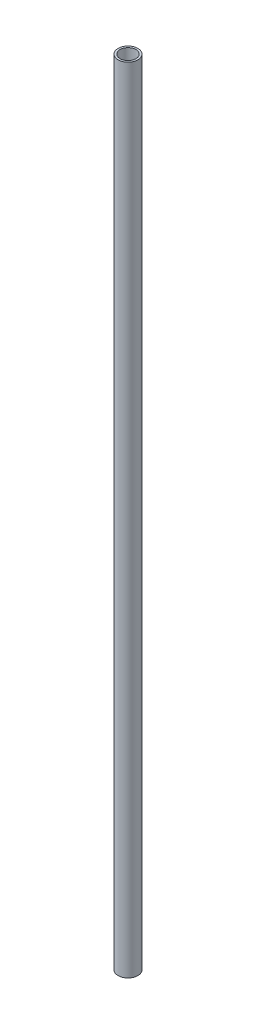
ISO-10303-21;
HEADER;
FILE_DESCRIPTION(('STEP AP214'),'2;1');
FILE_NAME('part.step','',(''),(''),'','','');
FILE_SCHEMA(('AUTOMOTIVE_DESIGN { 1 0 10303 214 1 1 1 1 }'));
ENDSEC;
DATA;
#1=APPLICATION_CONTEXT('core data for automotive mechanical design processes');
#2=APPLICATION_PROTOCOL_DEFINITION('international standard','automotive_design',2000,#1);
#3=PRODUCT_CONTEXT('',#1,'mechanical');
#4=PRODUCT('Part','Part','',(#3));
#5=PRODUCT_RELATED_PRODUCT_CATEGORY('part','',(#4));
#6=PRODUCT_DEFINITION_FORMATION('','',#4);
#7=PRODUCT_DEFINITION_CONTEXT('part definition',#1,'design');
#8=PRODUCT_DEFINITION('design','',#6,#7);
#9=PRODUCT_DEFINITION_SHAPE('','',#8);
#10=(LENGTH_UNIT() NAMED_UNIT(*) SI_UNIT(.MILLI.,.METRE.));
#11=(NAMED_UNIT(*) PLANE_ANGLE_UNIT() SI_UNIT($,.RADIAN.));
#12=(NAMED_UNIT(*) SI_UNIT($,.STERADIAN.) SOLID_ANGLE_UNIT());
#13=UNCERTAINTY_MEASURE_WITH_UNIT(LENGTH_MEASURE(1.E-05),#10,'distance_accuracy_value','');
#14=(GEOMETRIC_REPRESENTATION_CONTEXT(3) GLOBAL_UNCERTAINTY_ASSIGNED_CONTEXT((#13)) GLOBAL_UNIT_ASSIGNED_CONTEXT((#10,
#11,#12)) REPRESENTATION_CONTEXT('',''));
#15=CARTESIAN_POINT('',(0.,0.,0.));
#16=DIRECTION('',(0.,0.,1.));
#17=DIRECTION('',(1.,0.,0.));
#18=AXIS2_PLACEMENT_3D('',#15,#16,#17);
#19=CARTESIAN_POINT('',(0.,1000.,0.));
#20=DIRECTION('',(0.,1.,0.));
#21=DIRECTION('',(0.,0.,1.));
#22=AXIS2_PLACEMENT_3D('',#19,#20,#21);
#23=PLANE('',#22);
#24=CARTESIAN_POINT('',(0.,1000.,0.));
#25=DIRECTION('',(0.,1.,0.));
#26=DIRECTION('',(0.,0.,1.));
#27=AXIS2_PLACEMENT_3D('',#24,#25,#26);
#28=CIRCLE('',#27,12.5);
#29=CARTESIAN_POINT('',(0.,1000.,12.5));
#30=VERTEX_POINT('',#29);
#31=EDGE_CURVE('E10',#30,#30,#28,.T.);
#32=ORIENTED_EDGE('',*,*,#31,.T.);
#33=EDGE_LOOP('',(#32));
#34=FACE_BOUND('',#33,.T.);
#35=CARTESIAN_POINT('',(0.,1000.,0.));
#36=DIRECTION('',(0.,1.,0.));
#37=DIRECTION('',(0.,0.,1.));
#38=AXIS2_PLACEMENT_3D('',#35,#36,#37);
#39=CIRCLE('',#38,10.);
#40=CARTESIAN_POINT('',(0.,1000.,10.));
#41=VERTEX_POINT('',#40);
#42=EDGE_CURVE('E41',#41,#41,#39,.T.);
#43=ORIENTED_EDGE('',*,*,#42,.F.);
#44=EDGE_LOOP('',(#43));
#45=FACE_BOUND('',#44,.T.);
#46=ADVANCED_FACE('F30',(#34,#45),#23,.T.);
#47=CARTESIAN_POINT('',(0.,0.,0.));
#48=DIRECTION('',(0.,1.,0.));
#49=DIRECTION('',(0.,0.,1.));
#50=AXIS2_PLACEMENT_3D('',#47,#48,#49);
#51=PLANE('',#50);
#52=CARTESIAN_POINT('',(0.,0.,0.));
#53=DIRECTION('',(0.,1.,0.));
#54=DIRECTION('',(0.,0.,1.));
#55=AXIS2_PLACEMENT_3D('',#52,#53,#54);
#56=CIRCLE('',#55,12.5);
#57=CARTESIAN_POINT('',(0.,0.,12.5));
#58=VERTEX_POINT('',#57);
#59=EDGE_CURVE('E34',#58,#58,#56,.T.);
#60=ORIENTED_EDGE('',*,*,#59,.F.);
#61=EDGE_LOOP('',(#60));
#62=FACE_BOUND('',#61,.T.);
#63=CARTESIAN_POINT('',(0.,0.,0.));
#64=DIRECTION('',(0.,1.,0.));
#65=DIRECTION('',(0.,0.,1.));
#66=AXIS2_PLACEMENT_3D('',#63,#64,#65);
#67=CIRCLE('',#66,10.);
#68=CARTESIAN_POINT('',(0.,0.,10.));
#69=VERTEX_POINT('',#68);
#70=EDGE_CURVE('E43',#69,#69,#67,.T.);
#71=ORIENTED_EDGE('',*,*,#70,.T.);
#72=EDGE_LOOP('',(#71));
#73=FACE_BOUND('',#72,.T.);
#74=ADVANCED_FACE('F53',(#62,#73),#51,.F.);
#75=CARTESIAN_POINT('',(0.,1000.,0.));
#76=DIRECTION('',(0.,-1.,0.));
#77=DIRECTION('',(0.,0.,-1.));
#78=AXIS2_PLACEMENT_3D('',#75,#76,#77);
#79=CYLINDRICAL_SURFACE('',#78,12.5);
#80=ORIENTED_EDGE('',*,*,#31,.F.);
#81=EDGE_LOOP('',(#80));
#82=FACE_BOUND('',#81,.T.);
#83=ORIENTED_EDGE('',*,*,#59,.T.);
#84=EDGE_LOOP('',(#83));
#85=FACE_BOUND('',#84,.T.);
#86=ADVANCED_FACE('F32',(#82,#85),#79,.T.);
#87=CARTESIAN_POINT('',(0.,1000.,0.));
#88=DIRECTION('',(0.,-1.,0.));
#89=DIRECTION('',(0.,0.,-1.));
#90=AXIS2_PLACEMENT_3D('',#87,#88,#89);
#91=CYLINDRICAL_SURFACE('',#90,10.);
#92=ORIENTED_EDGE('',*,*,#42,.T.);
#93=EDGE_LOOP('',(#92));
#94=FACE_BOUND('',#93,.T.);
#95=ORIENTED_EDGE('',*,*,#70,.F.);
#96=EDGE_LOOP('',(#95));
#97=FACE_BOUND('',#96,.T.);
#98=ADVANCED_FACE('F49',(#94,#97),#91,.F.);
#99=CLOSED_SHELL('',(#46,#74,#86,#98));
#100=MANIFOLD_SOLID_BREP('B2',#99);
#101=ADVANCED_BREP_SHAPE_REPRESENTATION('',(#18,#100),#14);
#102=SHAPE_DEFINITION_REPRESENTATION(#9,#101);
ENDSEC;
END-ISO-10303-21;
